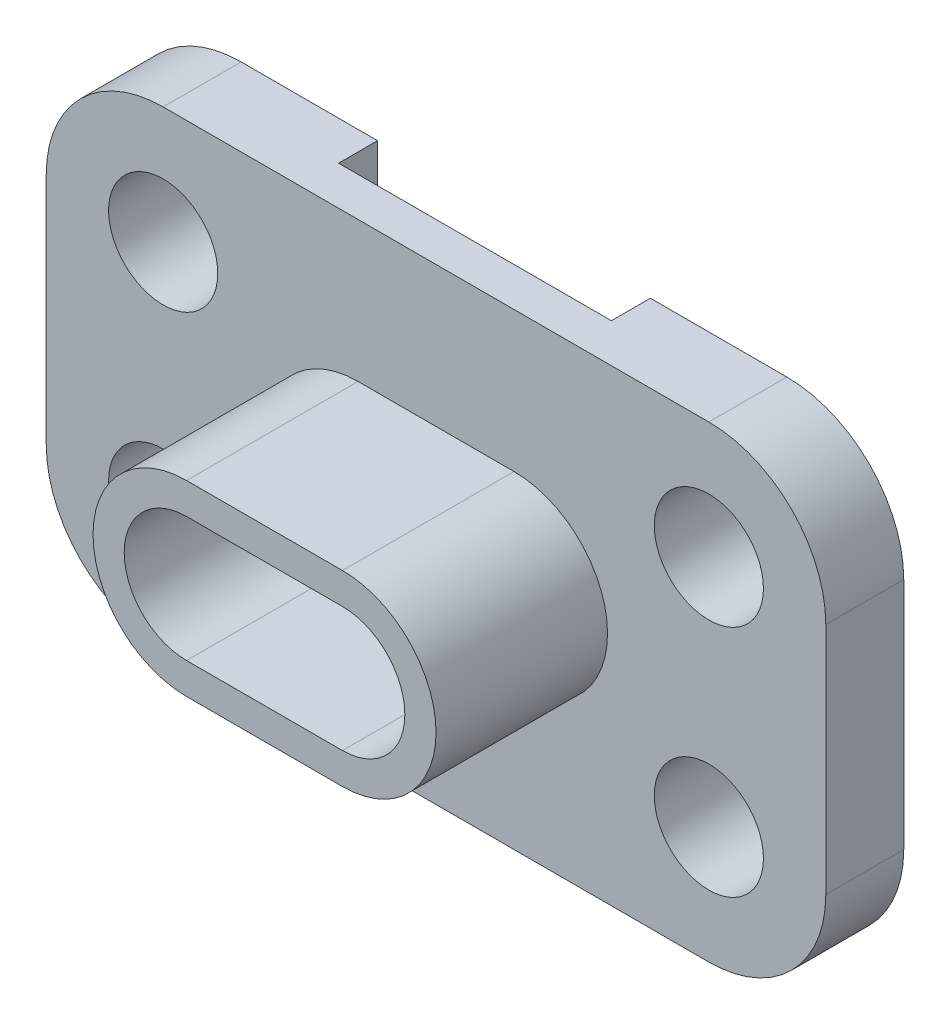
ISO-10303-21;
HEADER;
FILE_DESCRIPTION(('STEP AP214'),'2;1');
FILE_NAME('part.step','',(''),(''),'','','');
FILE_SCHEMA(('AUTOMOTIVE_DESIGN { 1 0 10303 214 1 1 1 1 }'));
ENDSEC;
DATA;
#1=APPLICATION_CONTEXT('core data for automotive mechanical design processes');
#2=APPLICATION_PROTOCOL_DEFINITION('international standard','automotive_design',2000,#1);
#3=PRODUCT_CONTEXT('',#1,'mechanical');
#4=PRODUCT('Part','Part','',(#3));
#5=PRODUCT_RELATED_PRODUCT_CATEGORY('part','',(#4));
#6=PRODUCT_DEFINITION_FORMATION('','',#4);
#7=PRODUCT_DEFINITION_CONTEXT('part definition',#1,'design');
#8=PRODUCT_DEFINITION('design','',#6,#7);
#9=PRODUCT_DEFINITION_SHAPE('','',#8);
#10=(LENGTH_UNIT() NAMED_UNIT(*) SI_UNIT(.MILLI.,.METRE.));
#11=(NAMED_UNIT(*) PLANE_ANGLE_UNIT() SI_UNIT($,.RADIAN.));
#12=(NAMED_UNIT(*) SI_UNIT($,.STERADIAN.) SOLID_ANGLE_UNIT());
#13=UNCERTAINTY_MEASURE_WITH_UNIT(LENGTH_MEASURE(1.E-05),#10,'distance_accuracy_value','');
#14=(GEOMETRIC_REPRESENTATION_CONTEXT(3) GLOBAL_UNCERTAINTY_ASSIGNED_CONTEXT((#13)) GLOBAL_UNIT_ASSIGNED_CONTEXT((#10,
#11,#12)) REPRESENTATION_CONTEXT('',''));
#15=CARTESIAN_POINT('',(0.,0.,0.));
#16=DIRECTION('',(0.,0.,1.));
#17=DIRECTION('',(1.,0.,0.));
#18=AXIS2_PLACEMENT_3D('',#15,#16,#17);
#19=CARTESIAN_POINT('',(35.,15.,0.));
#20=DIRECTION('',(0.,0.,1.));
#21=DIRECTION('',(1.,0.,0.));
#22=AXIS2_PLACEMENT_3D('',#19,#20,#21);
#23=PLANE('',#22);
#24=CARTESIAN_POINT('',(35.,-15.,0.));
#25=DIRECTION('',(0.,0.,1.));
#26=DIRECTION('',(1.,0.,0.));
#27=AXIS2_PLACEMENT_3D('',#24,#25,#26);
#28=CIRCLE('',#27,7.);
#29=CARTESIAN_POINT('',(42.,-15.,0.));
#30=VERTEX_POINT('',#29);
#31=EDGE_CURVE('E243',#30,#30,#28,.F.);
#32=ORIENTED_EDGE('',*,*,#31,.F.);
#33=EDGE_LOOP('',(#32));
#34=FACE_BOUND('',#33,.T.);
#35=CARTESIAN_POINT('',(35.,15.,0.));
#36=DIRECTION('',(0.,0.,1.));
#37=DIRECTION('',(1.,0.,0.));
#38=AXIS2_PLACEMENT_3D('',#35,#36,#37);
#39=CIRCLE('',#38,7.);
#40=CARTESIAN_POINT('',(42.,15.,0.));
#41=VERTEX_POINT('',#40);
#42=EDGE_CURVE('E242',#41,#41,#39,.F.);
#43=ORIENTED_EDGE('',*,*,#42,.F.);
#44=EDGE_LOOP('',(#43));
#45=FACE_BOUND('',#44,.T.);
#46=DIRECTION('',(1.,0.,0.));
#47=VECTOR('',#46,1.);
#48=CARTESIAN_POINT('',(-34.9999999999999,-30.,0.));
#49=LINE('',#48,#47);
#50=CARTESIAN_POINT('',(17.5,-30.,0.));
#51=VERTEX_POINT('',#50);
#52=CARTESIAN_POINT('',(34.9999999999999,-30.,0.));
#53=VERTEX_POINT('',#52);
#54=EDGE_CURVE('E319',#51,#53,#49,.T.);
#55=ORIENTED_EDGE('',*,*,#54,.F.);
#56=DIRECTION('',(0.,-1.,0.));
#57=VECTOR('',#56,1.);
#58=CARTESIAN_POINT('',(17.5,30.001,0.));
#59=LINE('',#58,#57);
#60=CARTESIAN_POINT('',(17.5,30.,0.));
#61=VERTEX_POINT('',#60);
#62=EDGE_CURVE('E279',#61,#51,#59,.T.);
#63=ORIENTED_EDGE('',*,*,#62,.F.);
#64=DIRECTION('',(-1.,0.,0.));
#65=VECTOR('',#64,1.);
#66=CARTESIAN_POINT('',(-34.9999999999999,30.,0.));
#67=LINE('',#66,#65);
#68=CARTESIAN_POINT('',(34.9999999999999,30.,0.));
#69=VERTEX_POINT('',#68);
#70=EDGE_CURVE('E310',#69,#61,#67,.T.);
#71=ORIENTED_EDGE('',*,*,#70,.F.);
#72=CARTESIAN_POINT('',(35.,15.,0.));
#73=DIRECTION('',(0.,0.,1.));
#74=DIRECTION('',(1.,0.,0.));
#75=AXIS2_PLACEMENT_3D('',#72,#73,#74);
#76=CIRCLE('',#75,15.);
#77=CARTESIAN_POINT('',(50.,14.9999999999999,0.));
#78=VERTEX_POINT('',#77);
#79=EDGE_CURVE('E287',#78,#69,#76,.T.);
#80=ORIENTED_EDGE('',*,*,#79,.F.);
#81=DIRECTION('',(0.,1.,0.));
#82=VECTOR('',#81,1.);
#83=CARTESIAN_POINT('',(50.,14.9999999999999,0.));
#84=LINE('',#83,#82);
#85=CARTESIAN_POINT('',(50.,-14.9999999999999,0.));
#86=VERTEX_POINT('',#85);
#87=EDGE_CURVE('E292',#86,#78,#84,.T.);
#88=ORIENTED_EDGE('',*,*,#87,.F.);
#89=CARTESIAN_POINT('',(35.,-15.,0.));
#90=DIRECTION('',(0.,0.,1.));
#91=DIRECTION('',(1.,0.,0.));
#92=AXIS2_PLACEMENT_3D('',#89,#90,#91);
#93=CIRCLE('',#92,15.);
#94=EDGE_CURVE('E323',#53,#86,#93,.T.);
#95=ORIENTED_EDGE('',*,*,#94,.F.);
#96=EDGE_LOOP('',(#55,#63,#71,#80,#88,#95));
#97=FACE_BOUND('',#96,.T.);
#98=ADVANCED_FACE('F33',(#34,#45,#97),#23,.F.);
#99=CARTESIAN_POINT('',(35.,15.,10.));
#100=DIRECTION('',(0.,0.,-1.));
#101=DIRECTION('',(-1.,0.,0.));
#102=AXIS2_PLACEMENT_3D('',#99,#100,#101);
#103=CYLINDRICAL_SURFACE('',#102,15.);
#104=ORIENTED_EDGE('',*,*,#79,.T.);
#105=DIRECTION('',(0.,0.,-1.));
#106=VECTOR('',#105,1.);
#107=CARTESIAN_POINT('',(34.9999999999999,30.,10.));
#108=LINE('',#107,#106);
#109=CARTESIAN_POINT('',(34.9999999999999,30.,10.));
#110=VERTEX_POINT('',#109);
#111=EDGE_CURVE('E11',#110,#69,#108,.T.);
#112=ORIENTED_EDGE('',*,*,#111,.F.);
#113=CARTESIAN_POINT('',(35.,15.,10.));
#114=DIRECTION('',(0.,0.,1.));
#115=DIRECTION('',(1.,0.,0.));
#116=AXIS2_PLACEMENT_3D('',#113,#114,#115);
#117=CIRCLE('',#116,15.);
#118=CARTESIAN_POINT('',(50.,14.9999999999999,10.));
#119=VERTEX_POINT('',#118);
#120=EDGE_CURVE('E288',#119,#110,#117,.T.);
#121=ORIENTED_EDGE('',*,*,#120,.F.);
#122=DIRECTION('',(0.,0.,-1.));
#123=VECTOR('',#122,1.);
#124=CARTESIAN_POINT('',(50.,14.9999999999999,10.));
#125=LINE('',#124,#123);
#126=EDGE_CURVE('E306',#119,#78,#125,.T.);
#127=ORIENTED_EDGE('',*,*,#126,.T.);
#128=EDGE_LOOP('',(#104,#112,#121,#127));
#129=FACE_BOUND('',#128,.T.);
#130=ADVANCED_FACE('F35',(#129),#103,.T.);
#131=CARTESIAN_POINT('',(-34.9999999999999,30.,10.));
#132=DIRECTION('',(0.,-1.,0.));
#133=DIRECTION('',(0.,0.,-1.));
#134=AXIS2_PLACEMENT_3D('',#131,#132,#133);
#135=PLANE('',#134);
#136=ORIENTED_EDGE('',*,*,#70,.T.);
#137=DIRECTION('',(0.,0.,-1.));
#138=VECTOR('',#137,1.);
#139=CARTESIAN_POINT('',(17.5,30.,0.));
#140=LINE('',#139,#138);
#141=CARTESIAN_POINT('',(17.5,30.,5.));
#142=VERTEX_POINT('',#141);
#143=EDGE_CURVE('E265',#142,#61,#140,.T.);
#144=ORIENTED_EDGE('',*,*,#143,.F.);
#145=DIRECTION('',(1.,0.,0.));
#146=VECTOR('',#145,1.);
#147=CARTESIAN_POINT('',(17.5,30.,5.));
#148=LINE('',#147,#146);
#149=CARTESIAN_POINT('',(-17.5,30.,5.));
#150=VERTEX_POINT('',#149);
#151=EDGE_CURVE('E262',#150,#142,#148,.T.);
#152=ORIENTED_EDGE('',*,*,#151,.F.);
#153=DIRECTION('',(0.,0.,1.));
#154=VECTOR('',#153,1.);
#155=CARTESIAN_POINT('',(-17.5,30.,5.));
#156=LINE('',#155,#154);
#157=CARTESIAN_POINT('',(-17.5,30.,0.));
#158=VERTEX_POINT('',#157);
#159=EDGE_CURVE('E278',#158,#150,#156,.T.);
#160=ORIENTED_EDGE('',*,*,#159,.F.);
#161=CARTESIAN_POINT('',(-34.9999999999999,30.,0.));
#162=VERTEX_POINT('',#161);
#163=EDGE_CURVE('E309',#158,#162,#67,.T.);
#164=ORIENTED_EDGE('',*,*,#163,.T.);
#165=DIRECTION('',(0.,0.,-1.));
#166=VECTOR('',#165,1.);
#167=CARTESIAN_POINT('',(-34.9999999999999,30.,10.));
#168=LINE('',#167,#166);
#169=CARTESIAN_POINT('',(-34.9999999999999,30.,10.));
#170=VERTEX_POINT('',#169);
#171=EDGE_CURVE('E41',#170,#162,#168,.T.);
#172=ORIENTED_EDGE('',*,*,#171,.F.);
#173=DIRECTION('',(-1.,0.,0.));
#174=VECTOR('',#173,1.);
#175=CARTESIAN_POINT('',(-34.9999999999999,30.,10.));
#176=LINE('',#175,#174);
#177=EDGE_CURVE('E291',#110,#170,#176,.T.);
#178=ORIENTED_EDGE('',*,*,#177,.F.);
#179=ORIENTED_EDGE('',*,*,#111,.T.);
#180=EDGE_LOOP('',(#136,#144,#152,#160,#164,#172,#178,#179));
#181=FACE_BOUND('',#180,.T.);
#182=ADVANCED_FACE('F370',(#181),#135,.F.);
#183=CARTESIAN_POINT('',(-35.,15.,10.));
#184=DIRECTION('',(0.,0.,-1.));
#185=DIRECTION('',(-1.,0.,0.));
#186=AXIS2_PLACEMENT_3D('',#183,#184,#185);
#187=CYLINDRICAL_SURFACE('',#186,15.);
#188=CARTESIAN_POINT('',(-35.,15.,0.));
#189=DIRECTION('',(0.,0.,1.));
#190=DIRECTION('',(-1.,0.,0.));
#191=AXIS2_PLACEMENT_3D('',#188,#189,#190);
#192=CIRCLE('',#191,15.);
#193=CARTESIAN_POINT('',(-50.,14.9999999999999,0.));
#194=VERTEX_POINT('',#193);
#195=EDGE_CURVE('E313',#162,#194,#192,.T.);
#196=ORIENTED_EDGE('',*,*,#195,.T.);
#197=DIRECTION('',(0.,0.,-1.));
#198=VECTOR('',#197,1.);
#199=CARTESIAN_POINT('',(-50.,14.9999999999999,10.));
#200=LINE('',#199,#198);
#201=CARTESIAN_POINT('',(-50.,14.9999999999999,10.));
#202=VERTEX_POINT('',#201);
#203=EDGE_CURVE('E340',#202,#194,#200,.T.);
#204=ORIENTED_EDGE('',*,*,#203,.F.);
#205=CARTESIAN_POINT('',(-35.,15.,10.));
#206=DIRECTION('',(0.,0.,1.));
#207=DIRECTION('',(-1.,0.,0.));
#208=AXIS2_PLACEMENT_3D('',#205,#206,#207);
#209=CIRCLE('',#208,15.);
#210=EDGE_CURVE('E294',#170,#202,#209,.T.);
#211=ORIENTED_EDGE('',*,*,#210,.F.);
#212=ORIENTED_EDGE('',*,*,#171,.T.);
#213=EDGE_LOOP('',(#196,#204,#211,#212));
#214=FACE_BOUND('',#213,.T.);
#215=ADVANCED_FACE('F347',(#214),#187,.T.);
#216=CARTESIAN_POINT('',(-50.,14.9999999999999,10.));
#217=DIRECTION('',(1.,0.,0.));
#218=DIRECTION('',(0.,0.,-1.));
#219=AXIS2_PLACEMENT_3D('',#216,#217,#218);
#220=PLANE('',#219);
#221=DIRECTION('',(0.,-1.,0.));
#222=VECTOR('',#221,1.);
#223=CARTESIAN_POINT('',(-50.,14.9999999999999,0.));
#224=LINE('',#223,#222);
#225=CARTESIAN_POINT('',(-50.,-15.,0.));
#226=VERTEX_POINT('',#225);
#227=EDGE_CURVE('E315',#194,#226,#224,.T.);
#228=ORIENTED_EDGE('',*,*,#227,.T.);
#229=DIRECTION('',(0.,0.,-1.));
#230=VECTOR('',#229,1.);
#231=CARTESIAN_POINT('',(-50.,-15.,10.));
#232=LINE('',#231,#230);
#233=CARTESIAN_POINT('',(-50.,-15.,10.));
#234=VERTEX_POINT('',#233);
#235=EDGE_CURVE('E337',#234,#226,#232,.T.);
#236=ORIENTED_EDGE('',*,*,#235,.F.);
#237=DIRECTION('',(0.,-1.,0.));
#238=VECTOR('',#237,1.);
#239=CARTESIAN_POINT('',(-50.,14.9999999999999,10.));
#240=LINE('',#239,#238);
#241=EDGE_CURVE('E296',#202,#234,#240,.T.);
#242=ORIENTED_EDGE('',*,*,#241,.F.);
#243=ORIENTED_EDGE('',*,*,#203,.T.);
#244=EDGE_LOOP('',(#228,#236,#242,#243));
#245=FACE_BOUND('',#244,.T.);
#246=ADVANCED_FACE('F358',(#245),#220,.F.);
#247=CARTESIAN_POINT('',(-35.,-15.,10.));
#248=DIRECTION('',(0.,0.,-1.));
#249=DIRECTION('',(-1.,0.,0.));
#250=AXIS2_PLACEMENT_3D('',#247,#248,#249);
#251=CYLINDRICAL_SURFACE('',#250,15.);
#252=CARTESIAN_POINT('',(-35.,-15.,0.));
#253=DIRECTION('',(0.,0.,1.));
#254=DIRECTION('',(-1.,0.,0.));
#255=AXIS2_PLACEMENT_3D('',#252,#253,#254);
#256=CIRCLE('',#255,15.);
#257=CARTESIAN_POINT('',(-34.9999999999999,-30.,0.));
#258=VERTEX_POINT('',#257);
#259=EDGE_CURVE('E317',#226,#258,#256,.T.);
#260=ORIENTED_EDGE('',*,*,#259,.T.);
#261=DIRECTION('',(0.,0.,-1.));
#262=VECTOR('',#261,1.);
#263=CARTESIAN_POINT('',(-34.9999999999999,-30.,10.));
#264=LINE('',#263,#262);
#265=CARTESIAN_POINT('',(-34.9999999999999,-30.,10.));
#266=VERTEX_POINT('',#265);
#267=EDGE_CURVE('E334',#266,#258,#264,.T.);
#268=ORIENTED_EDGE('',*,*,#267,.F.);
#269=CARTESIAN_POINT('',(-35.,-15.,10.));
#270=DIRECTION('',(0.,0.,1.));
#271=DIRECTION('',(-1.,0.,0.));
#272=AXIS2_PLACEMENT_3D('',#269,#270,#271);
#273=CIRCLE('',#272,15.);
#274=EDGE_CURVE('E298',#234,#266,#273,.T.);
#275=ORIENTED_EDGE('',*,*,#274,.F.);
#276=ORIENTED_EDGE('',*,*,#235,.T.);
#277=EDGE_LOOP('',(#260,#268,#275,#276));
#278=FACE_BOUND('',#277,.T.);
#279=ADVANCED_FACE('F362',(#278),#251,.T.);
#280=CARTESIAN_POINT('',(-34.9999999999999,-30.,10.));
#281=DIRECTION('',(0.,1.,0.));
#282=DIRECTION('',(0.,0.,1.));
#283=AXIS2_PLACEMENT_3D('',#280,#281,#282);
#284=PLANE('',#283);
#285=DIRECTION('',(-1.,0.,0.));
#286=VECTOR('',#285,1.);
#287=CARTESIAN_POINT('',(17.5,-30.,5.));
#288=LINE('',#287,#286);
#289=CARTESIAN_POINT('',(17.5,-30.,5.));
#290=VERTEX_POINT('',#289);
#291=CARTESIAN_POINT('',(-17.5,-30.,5.));
#292=VERTEX_POINT('',#291);
#293=EDGE_CURVE('E267',#290,#292,#288,.T.);
#294=ORIENTED_EDGE('',*,*,#293,.F.);
#295=DIRECTION('',(0.,0.,1.));
#296=VECTOR('',#295,1.);
#297=CARTESIAN_POINT('',(17.5,-30.,0.));
#298=LINE('',#297,#296);
#299=EDGE_CURVE('E272',#51,#290,#298,.T.);
#300=ORIENTED_EDGE('',*,*,#299,.F.);
#301=ORIENTED_EDGE('',*,*,#54,.T.);
#302=DIRECTION('',(0.,0.,-1.));
#303=VECTOR('',#302,1.);
#304=CARTESIAN_POINT('',(34.9999999999999,-30.,10.));
#305=LINE('',#304,#303);
#306=CARTESIAN_POINT('',(34.9999999999999,-30.,10.));
#307=VERTEX_POINT('',#306);
#308=EDGE_CURVE('E331',#307,#53,#305,.T.);
#309=ORIENTED_EDGE('',*,*,#308,.F.);
#310=DIRECTION('',(1.,0.,0.));
#311=VECTOR('',#310,1.);
#312=CARTESIAN_POINT('',(-34.9999999999999,-30.,10.));
#313=LINE('',#312,#311);
#314=EDGE_CURVE('E300',#266,#307,#313,.T.);
#315=ORIENTED_EDGE('',*,*,#314,.F.);
#316=ORIENTED_EDGE('',*,*,#267,.T.);
#317=CARTESIAN_POINT('',(-17.5,-30.,0.));
#318=VERTEX_POINT('',#317);
#319=EDGE_CURVE('E320',#258,#318,#49,.T.);
#320=ORIENTED_EDGE('',*,*,#319,.T.);
#321=DIRECTION('',(0.,0.,-1.));
#322=VECTOR('',#321,1.);
#323=CARTESIAN_POINT('',(-17.5,-30.,5.));
#324=LINE('',#323,#322);
#325=EDGE_CURVE('E270',#292,#318,#324,.T.);
#326=ORIENTED_EDGE('',*,*,#325,.F.);
#327=EDGE_LOOP('',(#294,#300,#301,#309,#315,#316,#320,#326));
#328=FACE_BOUND('',#327,.T.);
#329=ADVANCED_FACE('F385',(#328),#284,.F.);
#330=CARTESIAN_POINT('',(35.,-15.,10.));
#331=DIRECTION('',(0.,0.,-1.));
#332=DIRECTION('',(-1.,0.,0.));
#333=AXIS2_PLACEMENT_3D('',#330,#331,#332);
#334=CYLINDRICAL_SURFACE('',#333,15.);
#335=ORIENTED_EDGE('',*,*,#94,.T.);
#336=DIRECTION('',(0.,0.,-1.));
#337=VECTOR('',#336,1.);
#338=CARTESIAN_POINT('',(50.,-14.9999999999999,10.));
#339=LINE('',#338,#337);
#340=CARTESIAN_POINT('',(50.,-14.9999999999999,10.));
#341=VERTEX_POINT('',#340);
#342=EDGE_CURVE('E328',#341,#86,#339,.T.);
#343=ORIENTED_EDGE('',*,*,#342,.F.);
#344=CARTESIAN_POINT('',(35.,-15.,10.));
#345=DIRECTION('',(0.,0.,1.));
#346=DIRECTION('',(1.,0.,0.));
#347=AXIS2_PLACEMENT_3D('',#344,#345,#346);
#348=CIRCLE('',#347,15.);
#349=EDGE_CURVE('E302',#307,#341,#348,.T.);
#350=ORIENTED_EDGE('',*,*,#349,.F.);
#351=ORIENTED_EDGE('',*,*,#308,.T.);
#352=EDGE_LOOP('',(#335,#343,#350,#351));
#353=FACE_BOUND('',#352,.T.);
#354=ADVANCED_FACE('F396',(#353),#334,.T.);
#355=CARTESIAN_POINT('',(50.,14.9999999999999,10.));
#356=DIRECTION('',(-1.,0.,0.));
#357=DIRECTION('',(0.,0.,1.));
#358=AXIS2_PLACEMENT_3D('',#355,#356,#357);
#359=PLANE('',#358);
#360=ORIENTED_EDGE('',*,*,#87,.T.);
#361=ORIENTED_EDGE('',*,*,#126,.F.);
#362=DIRECTION('',(0.,1.,0.));
#363=VECTOR('',#362,1.);
#364=CARTESIAN_POINT('',(50.,14.9999999999999,10.));
#365=LINE('',#364,#363);
#366=EDGE_CURVE('E304',#341,#119,#365,.T.);
#367=ORIENTED_EDGE('',*,*,#366,.F.);
#368=ORIENTED_EDGE('',*,*,#342,.T.);
#369=EDGE_LOOP('',(#360,#361,#367,#368));
#370=FACE_BOUND('',#369,.T.);
#371=ADVANCED_FACE('F399',(#370),#359,.F.);
#372=CARTESIAN_POINT('',(35.,15.,10.));
#373=DIRECTION('',(0.,0.,1.));
#374=DIRECTION('',(1.,0.,0.));
#375=AXIS2_PLACEMENT_3D('',#372,#373,#374);
#376=PLANE('',#375);
#377=CARTESIAN_POINT('',(-10.,0.,10.));
#378=DIRECTION('',(0.,0.,1.));
#379=DIRECTION('',(1.,0.,0.));
#380=AXIS2_PLACEMENT_3D('',#377,#378,#379);
#381=CIRCLE('',#380,12.);
#382=CARTESIAN_POINT('',(-10.,12.,10.));
#383=VERTEX_POINT('',#382);
#384=CARTESIAN_POINT('',(-10.,-12.,10.));
#385=VERTEX_POINT('',#384);
#386=EDGE_CURVE('E56',#383,#385,#381,.T.);
#387=ORIENTED_EDGE('',*,*,#386,.F.);
#388=DIRECTION('',(-1.,0.,0.));
#389=VECTOR('',#388,1.);
#390=CARTESIAN_POINT('',(-10.,12.,10.));
#391=LINE('',#390,#389);
#392=CARTESIAN_POINT('',(10.,12.,10.));
#393=VERTEX_POINT('',#392);
#394=EDGE_CURVE('E212',#393,#383,#391,.T.);
#395=ORIENTED_EDGE('',*,*,#394,.F.);
#396=CARTESIAN_POINT('',(10.,0.,10.));
#397=DIRECTION('',(0.,0.,1.));
#398=DIRECTION('',(1.,0.,0.));
#399=AXIS2_PLACEMENT_3D('',#396,#397,#398);
#400=CIRCLE('',#399,12.);
#401=CARTESIAN_POINT('',(10.,-12.,10.));
#402=VERTEX_POINT('',#401);
#403=EDGE_CURVE('E223',#402,#393,#400,.T.);
#404=ORIENTED_EDGE('',*,*,#403,.F.);
#405=DIRECTION('',(1.,0.,0.));
#406=VECTOR('',#405,1.);
#407=CARTESIAN_POINT('',(-10.,-12.,10.));
#408=LINE('',#407,#406);
#409=EDGE_CURVE('E220',#385,#402,#408,.T.);
#410=ORIENTED_EDGE('',*,*,#409,.F.);
#411=EDGE_LOOP('',(#387,#395,#404,#410));
#412=FACE_BOUND('',#411,.T.);
#413=CARTESIAN_POINT('',(-35.,-15.0000000000001,10.));
#414=DIRECTION('',(0.,0.,1.));
#415=DIRECTION('',(-1.,0.,0.));
#416=AXIS2_PLACEMENT_3D('',#413,#414,#415);
#417=CIRCLE('',#416,7.);
#418=CARTESIAN_POINT('',(-42.,-15.0000000000001,10.));
#419=VERTEX_POINT('',#418);
#420=EDGE_CURVE('E238',#419,#419,#417,.T.);
#421=ORIENTED_EDGE('',*,*,#420,.F.);
#422=EDGE_LOOP('',(#421));
#423=FACE_BOUND('',#422,.T.);
#424=CARTESIAN_POINT('',(35.,-15.,10.));
#425=DIRECTION('',(0.,0.,1.));
#426=DIRECTION('',(-1.,0.,0.));
#427=AXIS2_PLACEMENT_3D('',#424,#425,#426);
#428=CIRCLE('',#427,7.);
#429=CARTESIAN_POINT('',(28.,-15.,10.));
#430=VERTEX_POINT('',#429);
#431=EDGE_CURVE('E247',#430,#430,#428,.T.);
#432=ORIENTED_EDGE('',*,*,#431,.F.);
#433=EDGE_LOOP('',(#432));
#434=FACE_BOUND('',#433,.T.);
#435=CARTESIAN_POINT('',(35.,15.,10.));
#436=DIRECTION('',(0.,0.,1.));
#437=DIRECTION('',(1.,0.,0.));
#438=AXIS2_PLACEMENT_3D('',#435,#436,#437);
#439=CIRCLE('',#438,7.);
#440=CARTESIAN_POINT('',(42.,15.,10.));
#441=VERTEX_POINT('',#440);
#442=EDGE_CURVE('E239',#441,#441,#439,.T.);
#443=ORIENTED_EDGE('',*,*,#442,.F.);
#444=EDGE_LOOP('',(#443));
#445=FACE_BOUND('',#444,.T.);
#446=CARTESIAN_POINT('',(-35.,15.,10.));
#447=DIRECTION('',(0.,0.,1.));
#448=DIRECTION('',(1.,0.,0.));
#449=AXIS2_PLACEMENT_3D('',#446,#447,#448);
#450=CIRCLE('',#449,7.);
#451=CARTESIAN_POINT('',(-28.,15.,10.));
#452=VERTEX_POINT('',#451);
#453=EDGE_CURVE('E246',#452,#452,#450,.T.);
#454=ORIENTED_EDGE('',*,*,#453,.F.);
#455=EDGE_LOOP('',(#454));
#456=FACE_BOUND('',#455,.T.);
#457=ORIENTED_EDGE('',*,*,#120,.T.);
#458=ORIENTED_EDGE('',*,*,#177,.T.);
#459=ORIENTED_EDGE('',*,*,#210,.T.);
#460=ORIENTED_EDGE('',*,*,#241,.T.);
#461=ORIENTED_EDGE('',*,*,#274,.T.);
#462=ORIENTED_EDGE('',*,*,#314,.T.);
#463=ORIENTED_EDGE('',*,*,#349,.T.);
#464=ORIENTED_EDGE('',*,*,#366,.T.);
#465=EDGE_LOOP('',(#457,#458,#459,#460,#461,#462,#463,#464));
#466=FACE_BOUND('',#465,.T.);
#467=ADVANCED_FACE('F366',(#412,#423,#434,#445,#456,#466),#376,.T.);
#468=CARTESIAN_POINT('',(-35.,-15.0000000000001,0.));
#469=DIRECTION('',(0.,0.,1.));
#470=DIRECTION('',(1.,0.,0.));
#471=AXIS2_PLACEMENT_3D('',#468,#469,#470);
#472=CIRCLE('',#471,7.);
#473=CARTESIAN_POINT('',(-28.,-15.0000000000001,0.));
#474=VERTEX_POINT('',#473);
#475=EDGE_CURVE('E250',#474,#474,#472,.F.);
#476=ORIENTED_EDGE('',*,*,#475,.F.);
#477=EDGE_LOOP('',(#476));
#478=FACE_BOUND('',#477,.T.);
#479=CARTESIAN_POINT('',(-35.,15.,0.));
#480=DIRECTION('',(0.,0.,1.));
#481=DIRECTION('',(1.,0.,0.));
#482=AXIS2_PLACEMENT_3D('',#479,#480,#481);
#483=CIRCLE('',#482,7.);
#484=CARTESIAN_POINT('',(-28.,15.,0.));
#485=VERTEX_POINT('',#484);
#486=EDGE_CURVE('E259',#485,#485,#483,.F.);
#487=ORIENTED_EDGE('',*,*,#486,.F.);
#488=EDGE_LOOP('',(#487));
#489=FACE_BOUND('',#488,.T.);
#490=ORIENTED_EDGE('',*,*,#163,.F.);
#491=DIRECTION('',(0.,-1.,0.));
#492=VECTOR('',#491,1.);
#493=CARTESIAN_POINT('',(-17.5,30.001,0.));
#494=LINE('',#493,#492);
#495=EDGE_CURVE('E281',#158,#318,#494,.T.);
#496=ORIENTED_EDGE('',*,*,#495,.T.);
#497=ORIENTED_EDGE('',*,*,#319,.F.);
#498=ORIENTED_EDGE('',*,*,#259,.F.);
#499=ORIENTED_EDGE('',*,*,#227,.F.);
#500=ORIENTED_EDGE('',*,*,#195,.F.);
#501=EDGE_LOOP('',(#490,#496,#497,#498,#499,#500));
#502=FACE_BOUND('',#501,.T.);
#503=ADVANCED_FACE('F353',(#478,#489,#502),#23,.F.);
#504=CARTESIAN_POINT('',(17.5,30.001,5.));
#505=DIRECTION('',(0.,0.,1.));
#506=DIRECTION('',(1.,0.,0.));
#507=AXIS2_PLACEMENT_3D('',#504,#505,#506);
#508=PLANE('',#507);
#509=ORIENTED_EDGE('',*,*,#151,.T.);
#510=DIRECTION('',(0.,-1.,0.));
#511=VECTOR('',#510,1.);
#512=CARTESIAN_POINT('',(17.5,30.001,5.));
#513=LINE('',#512,#511);
#514=EDGE_CURVE('E276',#142,#290,#513,.T.);
#515=ORIENTED_EDGE('',*,*,#514,.T.);
#516=ORIENTED_EDGE('',*,*,#293,.T.);
#517=DIRECTION('',(0.,-1.,0.));
#518=VECTOR('',#517,1.);
#519=CARTESIAN_POINT('',(-17.5,30.001,5.));
#520=LINE('',#519,#518);
#521=EDGE_CURVE('E275',#150,#292,#520,.T.);
#522=ORIENTED_EDGE('',*,*,#521,.F.);
#523=EDGE_LOOP('',(#509,#515,#516,#522));
#524=FACE_BOUND('',#523,.T.);
#525=ADVANCED_FACE('F388',(#524),#508,.F.);
#526=CARTESIAN_POINT('',(17.5,30.001,0.));
#527=DIRECTION('',(1.,0.,0.));
#528=DIRECTION('',(0.,0.,-1.));
#529=AXIS2_PLACEMENT_3D('',#526,#527,#528);
#530=PLANE('',#529);
#531=ORIENTED_EDGE('',*,*,#143,.T.);
#532=ORIENTED_EDGE('',*,*,#62,.T.);
#533=ORIENTED_EDGE('',*,*,#299,.T.);
#534=ORIENTED_EDGE('',*,*,#514,.F.);
#535=EDGE_LOOP('',(#531,#532,#533,#534));
#536=FACE_BOUND('',#535,.T.);
#537=ADVANCED_FACE('F382',(#536),#530,.F.);
#538=CARTESIAN_POINT('',(-17.5,30.001,5.));
#539=DIRECTION('',(-1.,0.,0.));
#540=DIRECTION('',(0.,0.,1.));
#541=AXIS2_PLACEMENT_3D('',#538,#539,#540);
#542=PLANE('',#541);
#543=ORIENTED_EDGE('',*,*,#159,.T.);
#544=ORIENTED_EDGE('',*,*,#521,.T.);
#545=ORIENTED_EDGE('',*,*,#325,.T.);
#546=ORIENTED_EDGE('',*,*,#495,.F.);
#547=EDGE_LOOP('',(#543,#544,#545,#546));
#548=FACE_BOUND('',#547,.T.);
#549=ADVANCED_FACE('F392',(#548),#542,.F.);
#550=CARTESIAN_POINT('',(-35.,15.,-0.000999999999999265));
#551=DIRECTION('',(0.,0.,1.));
#552=DIRECTION('',(1.,0.,0.));
#553=AXIS2_PLACEMENT_3D('',#550,#551,#552);
#554=CYLINDRICAL_SURFACE('',#553,7.);
#555=ORIENTED_EDGE('',*,*,#453,.T.);
#556=EDGE_LOOP('',(#555));
#557=FACE_BOUND('',#556,.T.);
#558=ORIENTED_EDGE('',*,*,#486,.T.);
#559=EDGE_LOOP('',(#558));
#560=FACE_BOUND('',#559,.T.);
#561=ADVANCED_FACE('F426',(#557,#560),#554,.F.);
#562=CARTESIAN_POINT('',(-35.,-15.0000000000001,-0.000999999999999265));
#563=DIRECTION('',(0.,0.,1.));
#564=DIRECTION('',(1.,0.,0.));
#565=AXIS2_PLACEMENT_3D('',#562,#563,#564);
#566=CYLINDRICAL_SURFACE('',#565,7.);
#567=ORIENTED_EDGE('',*,*,#420,.T.);
#568=EDGE_LOOP('',(#567));
#569=FACE_BOUND('',#568,.T.);
#570=ORIENTED_EDGE('',*,*,#475,.T.);
#571=EDGE_LOOP('',(#570));
#572=FACE_BOUND('',#571,.T.);
#573=ADVANCED_FACE('F428',(#569,#572),#566,.F.);
#574=CARTESIAN_POINT('',(35.,15.,-0.000999999999999265));
#575=DIRECTION('',(0.,0.,1.));
#576=DIRECTION('',(1.,0.,0.));
#577=AXIS2_PLACEMENT_3D('',#574,#575,#576);
#578=CYLINDRICAL_SURFACE('',#577,7.);
#579=ORIENTED_EDGE('',*,*,#442,.T.);
#580=EDGE_LOOP('',(#579));
#581=FACE_BOUND('',#580,.T.);
#582=ORIENTED_EDGE('',*,*,#42,.T.);
#583=EDGE_LOOP('',(#582));
#584=FACE_BOUND('',#583,.T.);
#585=ADVANCED_FACE('F435',(#581,#584),#578,.F.);
#586=CARTESIAN_POINT('',(35.,-15.,-0.000999999999999265));
#587=DIRECTION('',(0.,0.,1.));
#588=DIRECTION('',(1.,0.,0.));
#589=AXIS2_PLACEMENT_3D('',#586,#587,#588);
#590=CYLINDRICAL_SURFACE('',#589,7.);
#591=ORIENTED_EDGE('',*,*,#431,.T.);
#592=EDGE_LOOP('',(#591));
#593=FACE_BOUND('',#592,.T.);
#594=ORIENTED_EDGE('',*,*,#31,.T.);
#595=EDGE_LOOP('',(#594));
#596=FACE_BOUND('',#595,.T.);
#597=ADVANCED_FACE('F479',(#593,#596),#590,.F.);
#598=CARTESIAN_POINT('',(-10.,0.,32.));
#599=DIRECTION('',(0.,0.,-1.));
#600=DIRECTION('',(-1.,0.,0.));
#601=AXIS2_PLACEMENT_3D('',#598,#599,#600);
#602=CYLINDRICAL_SURFACE('',#601,12.);
#603=ORIENTED_EDGE('',*,*,#386,.T.);
#604=DIRECTION('',(0.,0.,-1.));
#605=VECTOR('',#604,1.);
#606=CARTESIAN_POINT('',(-10.,-12.,32.));
#607=LINE('',#606,#605);
#608=CARTESIAN_POINT('',(-10.,-12.,32.));
#609=VERTEX_POINT('',#608);
#610=EDGE_CURVE('E235',#609,#385,#607,.T.);
#611=ORIENTED_EDGE('',*,*,#610,.F.);
#612=CARTESIAN_POINT('',(-10.,0.,32.));
#613=DIRECTION('',(0.,0.,1.));
#614=DIRECTION('',(1.,0.,0.));
#615=AXIS2_PLACEMENT_3D('',#612,#613,#614);
#616=CIRCLE('',#615,12.);
#617=CARTESIAN_POINT('',(-10.,12.,32.));
#618=VERTEX_POINT('',#617);
#619=EDGE_CURVE('E208',#618,#609,#616,.T.);
#620=ORIENTED_EDGE('',*,*,#619,.F.);
#621=DIRECTION('',(0.,0.,-1.));
#622=VECTOR('',#621,1.);
#623=CARTESIAN_POINT('',(-10.,12.,32.));
#624=LINE('',#623,#622);
#625=EDGE_CURVE('E218',#618,#383,#624,.T.);
#626=ORIENTED_EDGE('',*,*,#625,.T.);
#627=EDGE_LOOP('',(#603,#611,#620,#626));
#628=FACE_BOUND('',#627,.T.);
#629=ADVANCED_FACE('F489',(#628),#602,.T.);
#630=CARTESIAN_POINT('',(-10.,-12.,32.));
#631=DIRECTION('',(0.,1.,0.));
#632=DIRECTION('',(0.,0.,1.));
#633=AXIS2_PLACEMENT_3D('',#630,#631,#632);
#634=PLANE('',#633);
#635=ORIENTED_EDGE('',*,*,#409,.T.);
#636=DIRECTION('',(0.,0.,-1.));
#637=VECTOR('',#636,1.);
#638=CARTESIAN_POINT('',(10.,-12.,32.));
#639=LINE('',#638,#637);
#640=CARTESIAN_POINT('',(10.,-12.,32.));
#641=VERTEX_POINT('',#640);
#642=EDGE_CURVE('E232',#641,#402,#639,.T.);
#643=ORIENTED_EDGE('',*,*,#642,.F.);
#644=DIRECTION('',(1.,0.,0.));
#645=VECTOR('',#644,1.);
#646=CARTESIAN_POINT('',(-10.,-12.,32.));
#647=LINE('',#646,#645);
#648=EDGE_CURVE('E211',#609,#641,#647,.T.);
#649=ORIENTED_EDGE('',*,*,#648,.F.);
#650=ORIENTED_EDGE('',*,*,#610,.T.);
#651=EDGE_LOOP('',(#635,#643,#649,#650));
#652=FACE_BOUND('',#651,.T.);
#653=ADVANCED_FACE('F504',(#652),#634,.F.);
#654=CARTESIAN_POINT('',(10.,0.,32.));
#655=DIRECTION('',(0.,0.,-1.));
#656=DIRECTION('',(-1.,0.,0.));
#657=AXIS2_PLACEMENT_3D('',#654,#655,#656);
#658=CYLINDRICAL_SURFACE('',#657,12.);
#659=ORIENTED_EDGE('',*,*,#403,.T.);
#660=DIRECTION('',(0.,0.,-1.));
#661=VECTOR('',#660,1.);
#662=CARTESIAN_POINT('',(10.,12.,32.));
#663=LINE('',#662,#661);
#664=CARTESIAN_POINT('',(10.,12.,32.));
#665=VERTEX_POINT('',#664);
#666=EDGE_CURVE('E229',#665,#393,#663,.T.);
#667=ORIENTED_EDGE('',*,*,#666,.F.);
#668=CARTESIAN_POINT('',(10.,0.,32.));
#669=DIRECTION('',(0.,0.,1.));
#670=DIRECTION('',(1.,0.,0.));
#671=AXIS2_PLACEMENT_3D('',#668,#669,#670);
#672=CIRCLE('',#671,12.);
#673=EDGE_CURVE('E214',#641,#665,#672,.T.);
#674=ORIENTED_EDGE('',*,*,#673,.F.);
#675=ORIENTED_EDGE('',*,*,#642,.T.);
#676=EDGE_LOOP('',(#659,#667,#674,#675));
#677=FACE_BOUND('',#676,.T.);
#678=ADVANCED_FACE('F514',(#677),#658,.T.);
#679=CARTESIAN_POINT('',(-10.,12.,32.));
#680=DIRECTION('',(0.,-1.,0.));
#681=DIRECTION('',(0.,0.,-1.));
#682=AXIS2_PLACEMENT_3D('',#679,#680,#681);
#683=PLANE('',#682);
#684=ORIENTED_EDGE('',*,*,#394,.T.);
#685=ORIENTED_EDGE('',*,*,#625,.F.);
#686=DIRECTION('',(-1.,0.,0.));
#687=VECTOR('',#686,1.);
#688=CARTESIAN_POINT('',(-10.,12.,32.));
#689=LINE('',#688,#687);
#690=EDGE_CURVE('E216',#665,#618,#689,.T.);
#691=ORIENTED_EDGE('',*,*,#690,.F.);
#692=ORIENTED_EDGE('',*,*,#666,.T.);
#693=EDGE_LOOP('',(#684,#685,#691,#692));
#694=FACE_BOUND('',#693,.T.);
#695=ADVANCED_FACE('F524',(#694),#683,.F.);
#696=CARTESIAN_POINT('',(-10.,0.,32.));
#697=DIRECTION('',(0.,0.,1.));
#698=DIRECTION('',(1.,0.,0.));
#699=AXIS2_PLACEMENT_3D('',#696,#697,#698);
#700=PLANE('',#699);
#701=CARTESIAN_POINT('',(-10.,0.,32.));
#702=DIRECTION('',(0.,0.,1.));
#703=DIRECTION('',(1.,0.,0.));
#704=AXIS2_PLACEMENT_3D('',#701,#702,#703);
#705=CIRCLE('',#704,8.);
#706=CARTESIAN_POINT('',(-10.,8.,32.));
#707=VERTEX_POINT('',#706);
#708=CARTESIAN_POINT('',(-10.,-8.,32.));
#709=VERTEX_POINT('',#708);
#710=EDGE_CURVE('E48',#707,#709,#705,.T.);
#711=ORIENTED_EDGE('',*,*,#710,.F.);
#712=DIRECTION('',(-1.,0.,0.));
#713=VECTOR('',#712,1.);
#714=CARTESIAN_POINT('',(-10.,8.,32.));
#715=LINE('',#714,#713);
#716=CARTESIAN_POINT('',(10.,8.,32.));
#717=VERTEX_POINT('',#716);
#718=EDGE_CURVE('E190',#717,#707,#715,.T.);
#719=ORIENTED_EDGE('',*,*,#718,.F.);
#720=CARTESIAN_POINT('',(10.,0.,32.));
#721=DIRECTION('',(0.,0.,1.));
#722=DIRECTION('',(1.,0.,0.));
#723=AXIS2_PLACEMENT_3D('',#720,#721,#722);
#724=CIRCLE('',#723,8.);
#725=CARTESIAN_POINT('',(10.,-8.,32.));
#726=VERTEX_POINT('',#725);
#727=EDGE_CURVE('E193',#726,#717,#724,.T.);
#728=ORIENTED_EDGE('',*,*,#727,.F.);
#729=DIRECTION('',(1.,0.,0.));
#730=VECTOR('',#729,1.);
#731=CARTESIAN_POINT('',(-10.,-8.,32.));
#732=LINE('',#731,#730);
#733=EDGE_CURVE('E199',#709,#726,#732,.T.);
#734=ORIENTED_EDGE('',*,*,#733,.F.);
#735=EDGE_LOOP('',(#711,#719,#728,#734));
#736=FACE_BOUND('',#735,.T.);
#737=ORIENTED_EDGE('',*,*,#619,.T.);
#738=ORIENTED_EDGE('',*,*,#648,.T.);
#739=ORIENTED_EDGE('',*,*,#673,.T.);
#740=ORIENTED_EDGE('',*,*,#690,.T.);
#741=EDGE_LOOP('',(#737,#738,#739,#740));
#742=FACE_BOUND('',#741,.T.);
#743=ADVANCED_FACE('F534',(#736,#742),#700,.T.);
#744=CARTESIAN_POINT('',(-10.,0.,10.));
#745=DIRECTION('',(0.,0.,1.));
#746=DIRECTION('',(1.,0.,0.));
#747=AXIS2_PLACEMENT_3D('',#744,#745,#746);
#748=CYLINDRICAL_SURFACE('',#747,8.);
#749=ORIENTED_EDGE('',*,*,#710,.T.);
#750=DIRECTION('',(0.,0.,1.));
#751=VECTOR('',#750,1.);
#752=CARTESIAN_POINT('',(-10.,-8.,10.));
#753=LINE('',#752,#751);
#754=CARTESIAN_POINT('',(-10.,-8.,10.));
#755=VERTEX_POINT('',#754);
#756=EDGE_CURVE('E168',#755,#709,#753,.T.);
#757=ORIENTED_EDGE('',*,*,#756,.F.);
#758=CARTESIAN_POINT('',(-10.,0.,10.));
#759=DIRECTION('',(0.,0.,1.));
#760=DIRECTION('',(1.,0.,0.));
#761=AXIS2_PLACEMENT_3D('',#758,#759,#760);
#762=CIRCLE('',#761,8.);
#763=CARTESIAN_POINT('',(-10.,8.,10.));
#764=VERTEX_POINT('',#763);
#765=EDGE_CURVE('E172',#764,#755,#762,.T.);
#766=ORIENTED_EDGE('',*,*,#765,.F.);
#767=DIRECTION('',(0.,0.,1.));
#768=VECTOR('',#767,1.);
#769=CARTESIAN_POINT('',(-10.,8.,10.));
#770=LINE('',#769,#768);
#771=EDGE_CURVE('E203',#764,#707,#770,.T.);
#772=ORIENTED_EDGE('',*,*,#771,.T.);
#773=EDGE_LOOP('',(#749,#757,#766,#772));
#774=FACE_BOUND('',#773,.T.);
#775=ADVANCED_FACE('F170',(#774),#748,.F.);
#776=CARTESIAN_POINT('',(-10.,8.,10.));
#777=DIRECTION('',(0.,1.,0.));
#778=DIRECTION('',(0.,0.,1.));
#779=AXIS2_PLACEMENT_3D('',#776,#777,#778);
#780=PLANE('',#779);
#781=ORIENTED_EDGE('',*,*,#718,.T.);
#782=ORIENTED_EDGE('',*,*,#771,.F.);
#783=DIRECTION('',(-1.,0.,0.));
#784=VECTOR('',#783,1.);
#785=CARTESIAN_POINT('',(-10.,8.,10.));
#786=LINE('',#785,#784);
#787=CARTESIAN_POINT('',(10.,8.,10.));
#788=VERTEX_POINT('',#787);
#789=EDGE_CURVE('E178',#788,#764,#786,.T.);
#790=ORIENTED_EDGE('',*,*,#789,.F.);
#791=DIRECTION('',(0.,0.,1.));
#792=VECTOR('',#791,1.);
#793=CARTESIAN_POINT('',(10.,8.,10.));
#794=LINE('',#793,#792);
#795=EDGE_CURVE('E205',#788,#717,#794,.T.);
#796=ORIENTED_EDGE('',*,*,#795,.T.);
#797=EDGE_LOOP('',(#781,#782,#790,#796));
#798=FACE_BOUND('',#797,.T.);
#799=ADVANCED_FACE('F553',(#798),#780,.F.);
#800=CARTESIAN_POINT('',(10.,0.,10.));
#801=DIRECTION('',(0.,0.,1.));
#802=DIRECTION('',(1.,0.,0.));
#803=AXIS2_PLACEMENT_3D('',#800,#801,#802);
#804=CYLINDRICAL_SURFACE('',#803,8.);
#805=ORIENTED_EDGE('',*,*,#727,.T.);
#806=ORIENTED_EDGE('',*,*,#795,.F.);
#807=CARTESIAN_POINT('',(10.,0.,10.));
#808=DIRECTION('',(0.,0.,1.));
#809=DIRECTION('',(1.,0.,0.));
#810=AXIS2_PLACEMENT_3D('',#807,#808,#809);
#811=CIRCLE('',#810,8.);
#812=CARTESIAN_POINT('',(10.,-8.,10.));
#813=VERTEX_POINT('',#812);
#814=EDGE_CURVE('E186',#813,#788,#811,.T.);
#815=ORIENTED_EDGE('',*,*,#814,.F.);
#816=DIRECTION('',(0.,0.,1.));
#817=VECTOR('',#816,1.);
#818=CARTESIAN_POINT('',(10.,-8.,10.));
#819=LINE('',#818,#817);
#820=EDGE_CURVE('E177',#813,#726,#819,.T.);
#821=ORIENTED_EDGE('',*,*,#820,.T.);
#822=EDGE_LOOP('',(#805,#806,#815,#821));
#823=FACE_BOUND('',#822,.T.);
#824=ADVANCED_FACE('F562',(#823),#804,.F.);
#825=CARTESIAN_POINT('',(-10.,-8.,10.));
#826=DIRECTION('',(0.,-1.,0.));
#827=DIRECTION('',(0.,0.,-1.));
#828=AXIS2_PLACEMENT_3D('',#825,#826,#827);
#829=PLANE('',#828);
#830=ORIENTED_EDGE('',*,*,#733,.T.);
#831=ORIENTED_EDGE('',*,*,#820,.F.);
#832=DIRECTION('',(1.,0.,0.));
#833=VECTOR('',#832,1.);
#834=CARTESIAN_POINT('',(-10.,-8.,10.));
#835=LINE('',#834,#833);
#836=EDGE_CURVE('E181',#755,#813,#835,.T.);
#837=ORIENTED_EDGE('',*,*,#836,.F.);
#838=ORIENTED_EDGE('',*,*,#756,.T.);
#839=EDGE_LOOP('',(#830,#831,#837,#838));
#840=FACE_BOUND('',#839,.T.);
#841=ADVANCED_FACE('F182',(#840),#829,.F.);
#842=CARTESIAN_POINT('',(-10.,0.,10.));
#843=DIRECTION('',(0.,0.,1.));
#844=DIRECTION('',(1.,0.,0.));
#845=AXIS2_PLACEMENT_3D('',#842,#843,#844);
#846=PLANE('',#845);
#847=ORIENTED_EDGE('',*,*,#765,.T.);
#848=ORIENTED_EDGE('',*,*,#836,.T.);
#849=ORIENTED_EDGE('',*,*,#814,.T.);
#850=ORIENTED_EDGE('',*,*,#789,.T.);
#851=EDGE_LOOP('',(#847,#848,#849,#850));
#852=FACE_BOUND('',#851,.T.);
#853=ADVANCED_FACE('F188',(#852),#846,.T.);
#854=CLOSED_SHELL('',(#98,#130,#182,#215,#246,#279,#329,#354,#371,#467,#503,#525,#537,#549,#561,
#573,#585,#597,#629,#653,#678,#695,#743,#775,#799,#824,#841,#853));
#855=MANIFOLD_SOLID_BREP('B2',#854);
#856=ADVANCED_BREP_SHAPE_REPRESENTATION('',(#18,#855),#14);
#857=SHAPE_DEFINITION_REPRESENTATION(#9,#856);
ENDSEC;
END-ISO-10303-21;
